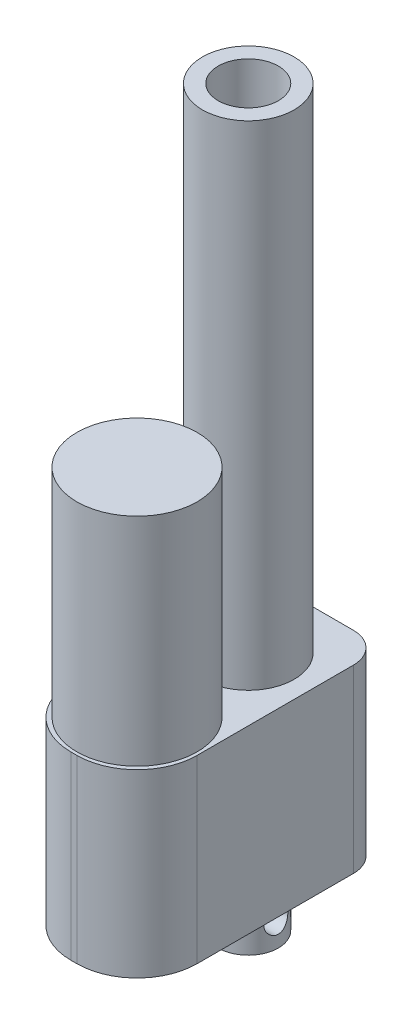
ISO-10303-21;
HEADER;
FILE_DESCRIPTION(('STEP AP214'),'2;1');
FILE_NAME('part.step','',(''),(''),'','','');
FILE_SCHEMA(('AUTOMOTIVE_DESIGN { 1 0 10303 214 1 1 1 1 }'));
ENDSEC;
DATA;
#1=APPLICATION_CONTEXT('core data for automotive mechanical design processes');
#2=APPLICATION_PROTOCOL_DEFINITION('international standard','automotive_design',2000,#1);
#3=PRODUCT_CONTEXT('',#1,'mechanical');
#4=PRODUCT('Part','Part','',(#3));
#5=PRODUCT_RELATED_PRODUCT_CATEGORY('part','',(#4));
#6=PRODUCT_DEFINITION_FORMATION('','',#4);
#7=PRODUCT_DEFINITION_CONTEXT('part definition',#1,'design');
#8=PRODUCT_DEFINITION('design','',#6,#7);
#9=PRODUCT_DEFINITION_SHAPE('','',#8);
#10=(LENGTH_UNIT() NAMED_UNIT(*) SI_UNIT(.MILLI.,.METRE.));
#11=(NAMED_UNIT(*) PLANE_ANGLE_UNIT() SI_UNIT($,.RADIAN.));
#12=(NAMED_UNIT(*) SI_UNIT($,.STERADIAN.) SOLID_ANGLE_UNIT());
#13=UNCERTAINTY_MEASURE_WITH_UNIT(LENGTH_MEASURE(1.E-05),#10,'distance_accuracy_value','');
#14=(GEOMETRIC_REPRESENTATION_CONTEXT(3) GLOBAL_UNCERTAINTY_ASSIGNED_CONTEXT((#13)) GLOBAL_UNIT_ASSIGNED_CONTEXT((#10,
#11,#12)) REPRESENTATION_CONTEXT('',''));
#15=CARTESIAN_POINT('',(0.,0.,0.));
#16=DIRECTION('',(0.,0.,1.));
#17=DIRECTION('',(1.,0.,0.));
#18=AXIS2_PLACEMENT_3D('',#15,#16,#17);
#19=CARTESIAN_POINT('',(-1.,-60.,38.));
#20=DIRECTION('',(0.,-1.,0.));
#21=DIRECTION('',(0.,0.,-1.));
#22=AXIS2_PLACEMENT_3D('',#19,#20,#21);
#23=PLANE('',#22);
#24=DIRECTION('',(1.,0.,0.));
#25=VECTOR('',#24,1.);
#26=CARTESIAN_POINT('',(-21.,-60.,-24.));
#27=LINE('',#26,#25);
#28=CARTESIAN_POINT('',(-11.,-60.,-24.));
#29=VERTEX_POINT('',#28);
#30=CARTESIAN_POINT('',(11.,-60.,-24.));
#31=VERTEX_POINT('',#30);
#32=EDGE_CURVE('E242',#29,#31,#27,.T.);
#33=ORIENTED_EDGE('',*,*,#32,.T.);
#34=CARTESIAN_POINT('',(11.,-60.,-14.));
#35=DIRECTION('',(0.,-1.,0.));
#36=DIRECTION('',(0.,0.,-1.));
#37=AXIS2_PLACEMENT_3D('',#34,#35,#36);
#38=CIRCLE('',#37,10.);
#39=CARTESIAN_POINT('',(21.,-60.,-14.));
#40=VERTEX_POINT('',#39);
#41=EDGE_CURVE('E42',#31,#40,#38,.T.);
#42=ORIENTED_EDGE('',*,*,#41,.T.);
#43=DIRECTION('',(0.,0.,1.));
#44=VECTOR('',#43,1.);
#45=CARTESIAN_POINT('',(21.,-60.,37.9999999999999));
#46=LINE('',#45,#44);
#47=CARTESIAN_POINT('',(21.,-60.,37.9999999999999));
#48=VERTEX_POINT('',#47);
#49=EDGE_CURVE('E100',#40,#48,#46,.T.);
#50=ORIENTED_EDGE('',*,*,#49,.T.);
#51=CARTESIAN_POINT('',(0.999999999999997,-60.,38.));
#52=DIRECTION('',(0.,-1.,0.));
#53=DIRECTION('',(0.,0.,-1.));
#54=AXIS2_PLACEMENT_3D('',#51,#52,#53);
#55=CIRCLE('',#54,20.);
#56=CARTESIAN_POINT('',(0.999999999999852,-60.,58.));
#57=VERTEX_POINT('',#56);
#58=EDGE_CURVE('E103',#48,#57,#55,.T.);
#59=ORIENTED_EDGE('',*,*,#58,.T.);
#60=DIRECTION('',(-1.,0.,0.));
#61=VECTOR('',#60,1.);
#62=CARTESIAN_POINT('',(-0.999999999999862,-60.,58.));
#63=LINE('',#62,#61);
#64=CARTESIAN_POINT('',(-0.99999999999986,-60.,58.));
#65=VERTEX_POINT('',#64);
#66=EDGE_CURVE('E119',#57,#65,#63,.T.);
#67=ORIENTED_EDGE('',*,*,#66,.T.);
#68=CARTESIAN_POINT('',(-1.,-60.,38.));
#69=DIRECTION('',(0.,-1.,0.));
#70=DIRECTION('',(0.,0.,-1.));
#71=AXIS2_PLACEMENT_3D('',#68,#69,#70);
#72=CIRCLE('',#71,20.);
#73=CARTESIAN_POINT('',(-21.,-60.,37.9999999999999));
#74=VERTEX_POINT('',#73);
#75=EDGE_CURVE('E258',#65,#74,#72,.T.);
#76=ORIENTED_EDGE('',*,*,#75,.T.);
#77=DIRECTION('',(0.,0.,-1.));
#78=VECTOR('',#77,1.);
#79=CARTESIAN_POINT('',(-21.,-60.,37.9999999999999));
#80=LINE('',#79,#78);
#81=CARTESIAN_POINT('',(-21.,-60.,-14.));
#82=VERTEX_POINT('',#81);
#83=EDGE_CURVE('E262',#74,#82,#80,.T.);
#84=ORIENTED_EDGE('',*,*,#83,.T.);
#85=CARTESIAN_POINT('',(-11.,-60.,-14.));
#86=DIRECTION('',(0.,-1.,0.));
#87=DIRECTION('',(0.,0.,-1.));
#88=AXIS2_PLACEMENT_3D('',#85,#86,#87);
#89=CIRCLE('',#88,10.);
#90=EDGE_CURVE('E219',#82,#29,#89,.T.);
#91=ORIENTED_EDGE('',*,*,#90,.T.);
#92=EDGE_LOOP('',(#33,#42,#50,#59,#67,#76,#84,#91));
#93=FACE_BOUND('',#92,.T.);
#94=CARTESIAN_POINT('',(0.,-60.,0.));
#95=DIRECTION('',(0.,-1.,0.));
#96=DIRECTION('',(0.,0.,-1.));
#97=AXIS2_PLACEMENT_3D('',#94,#95,#96);
#98=CIRCLE('',#97,10.);
#99=CARTESIAN_POINT('',(0.,-60.,-10.));
#100=VERTEX_POINT('',#99);
#101=EDGE_CURVE('E266',#100,#100,#98,.T.);
#102=ORIENTED_EDGE('',*,*,#101,.F.);
#103=EDGE_LOOP('',(#102));
#104=FACE_BOUND('',#103,.T.);
#105=ADVANCED_FACE('F34',(#93,#104),#23,.T.);
#106=CARTESIAN_POINT('',(-1.,0.,38.));
#107=DIRECTION('',(0.,-1.,0.));
#108=DIRECTION('',(0.,0.,-1.));
#109=AXIS2_PLACEMENT_3D('',#106,#107,#108);
#110=PLANE('',#109);
#111=CARTESIAN_POINT('',(0.,0.,0.));
#112=DIRECTION('',(0.,-1.,0.));
#113=DIRECTION('',(0.,0.,-1.));
#114=AXIS2_PLACEMENT_3D('',#111,#112,#113);
#115=CIRCLE('',#114,15.25);
#116=CARTESIAN_POINT('',(0.,0.,-15.25));
#117=VERTEX_POINT('',#116);
#118=EDGE_CURVE('E125',#117,#117,#115,.T.);
#119=ORIENTED_EDGE('',*,*,#118,.T.);
#120=EDGE_LOOP('',(#119));
#121=FACE_BOUND('',#120,.T.);
#122=DIRECTION('',(0.,0.,1.));
#123=VECTOR('',#122,1.);
#124=CARTESIAN_POINT('',(21.,0.,37.9999999999999));
#125=LINE('',#124,#123);
#126=CARTESIAN_POINT('',(21.,0.,-14.));
#127=VERTEX_POINT('',#126);
#128=CARTESIAN_POINT('',(21.,0.,37.9999999999999));
#129=VERTEX_POINT('',#128);
#130=EDGE_CURVE('E123',#127,#129,#125,.T.);
#131=ORIENTED_EDGE('',*,*,#130,.F.);
#132=CARTESIAN_POINT('',(11.,0.,-14.));
#133=DIRECTION('',(0.,-1.,0.));
#134=DIRECTION('',(0.,0.,-1.));
#135=AXIS2_PLACEMENT_3D('',#132,#133,#134);
#136=CIRCLE('',#135,10.);
#137=CARTESIAN_POINT('',(11.,0.,-24.));
#138=VERTEX_POINT('',#137);
#139=EDGE_CURVE('E226',#127,#138,#136,.F.);
#140=ORIENTED_EDGE('',*,*,#139,.T.);
#141=DIRECTION('',(1.,0.,0.));
#142=VECTOR('',#141,1.);
#143=CARTESIAN_POINT('',(-21.,0.,-24.));
#144=LINE('',#143,#142);
#145=CARTESIAN_POINT('',(-11.,0.,-24.));
#146=VERTEX_POINT('',#145);
#147=EDGE_CURVE('E110',#146,#138,#144,.T.);
#148=ORIENTED_EDGE('',*,*,#147,.F.);
#149=CARTESIAN_POINT('',(-11.,0.,-14.));
#150=DIRECTION('',(0.,-1.,0.));
#151=DIRECTION('',(0.,0.,-1.));
#152=AXIS2_PLACEMENT_3D('',#149,#150,#151);
#153=CIRCLE('',#152,10.);
#154=CARTESIAN_POINT('',(-21.,0.,-14.));
#155=VERTEX_POINT('',#154);
#156=EDGE_CURVE('E228',#146,#155,#153,.F.);
#157=ORIENTED_EDGE('',*,*,#156,.T.);
#158=DIRECTION('',(0.,0.,-1.));
#159=VECTOR('',#158,1.);
#160=CARTESIAN_POINT('',(-21.,0.,37.9999999999999));
#161=LINE('',#160,#159);
#162=CARTESIAN_POINT('',(-21.,0.,37.9999999999999));
#163=VERTEX_POINT('',#162);
#164=EDGE_CURVE('E248',#163,#155,#161,.T.);
#165=ORIENTED_EDGE('',*,*,#164,.F.);
#166=CARTESIAN_POINT('',(-1.,0.,38.));
#167=DIRECTION('',(0.,-1.,0.));
#168=DIRECTION('',(0.,0.,-1.));
#169=AXIS2_PLACEMENT_3D('',#166,#167,#168);
#170=CIRCLE('',#169,20.);
#171=CARTESIAN_POINT('',(-0.99999999999986,0.,58.));
#172=VERTEX_POINT('',#171);
#173=EDGE_CURVE('E246',#172,#163,#170,.T.);
#174=ORIENTED_EDGE('',*,*,#173,.F.);
#175=DIRECTION('',(-1.,0.,0.));
#176=VECTOR('',#175,1.);
#177=CARTESIAN_POINT('',(-0.999999999999862,0.,58.));
#178=LINE('',#177,#176);
#179=CARTESIAN_POINT('',(0.999999999999852,0.,58.));
#180=VERTEX_POINT('',#179);
#181=EDGE_CURVE('E236',#180,#172,#178,.T.);
#182=ORIENTED_EDGE('',*,*,#181,.F.);
#183=CARTESIAN_POINT('',(0.999999999999997,0.,38.));
#184=DIRECTION('',(0.,-1.,0.));
#185=DIRECTION('',(0.,0.,-1.));
#186=AXIS2_PLACEMENT_3D('',#183,#184,#185);
#187=CIRCLE('',#186,20.);
#188=EDGE_CURVE('E233',#129,#180,#187,.T.);
#189=ORIENTED_EDGE('',*,*,#188,.F.);
#190=EDGE_LOOP('',(#131,#140,#148,#157,#165,#174,#182,#189));
#191=FACE_BOUND('',#190,.T.);
#192=CARTESIAN_POINT('',(0.,0.,37.));
#193=DIRECTION('',(0.,-1.,0.));
#194=DIRECTION('',(0.,0.,-1.));
#195=AXIS2_PLACEMENT_3D('',#192,#193,#194);
#196=CIRCLE('',#195,20.);
#197=CARTESIAN_POINT('',(0.,0.,17.));
#198=VERTEX_POINT('',#197);
#199=EDGE_CURVE('E136',#198,#198,#196,.F.);
#200=ORIENTED_EDGE('',*,*,#199,.F.);
#201=EDGE_LOOP('',(#200));
#202=FACE_BOUND('',#201,.T.);
#203=ADVANCED_FACE('F174',(#121,#191,#202),#110,.F.);
#204=CARTESIAN_POINT('',(0.,164.,0.));
#205=DIRECTION('',(0.,-1.,0.));
#206=DIRECTION('',(0.,0.,-1.));
#207=AXIS2_PLACEMENT_3D('',#204,#205,#206);
#208=CYLINDRICAL_SURFACE('',#207,15.25);
#209=CARTESIAN_POINT('',(0.,164.,0.));
#210=DIRECTION('',(0.,1.,0.));
#211=DIRECTION('',(0.,0.,1.));
#212=AXIS2_PLACEMENT_3D('',#209,#210,#211);
#213=CIRCLE('',#212,15.25);
#214=CARTESIAN_POINT('',(0.,164.,15.25));
#215=VERTEX_POINT('',#214);
#216=EDGE_CURVE('E128',#215,#215,#213,.T.);
#217=ORIENTED_EDGE('',*,*,#216,.F.);
#218=EDGE_LOOP('',(#217));
#219=FACE_BOUND('',#218,.T.);
#220=ORIENTED_EDGE('',*,*,#118,.F.);
#221=EDGE_LOOP('',(#220));
#222=FACE_BOUND('',#221,.T.);
#223=ADVANCED_FACE('F179',(#219,#222),#208,.T.);
#224=CARTESIAN_POINT('',(0.,164.,0.));
#225=DIRECTION('',(0.,1.,0.));
#226=DIRECTION('',(0.,0.,1.));
#227=AXIS2_PLACEMENT_3D('',#224,#225,#226);
#228=PLANE('',#227);
#229=CARTESIAN_POINT('',(0.,164.,0.));
#230=DIRECTION('',(0.,1.,0.));
#231=DIRECTION('',(0.,0.,1.));
#232=AXIS2_PLACEMENT_3D('',#229,#230,#231);
#233=CIRCLE('',#232,10.);
#234=CARTESIAN_POINT('',(0.,164.,10.));
#235=VERTEX_POINT('',#234);
#236=EDGE_CURVE('E270',#235,#235,#233,.T.);
#237=ORIENTED_EDGE('',*,*,#236,.F.);
#238=EDGE_LOOP('',(#237));
#239=FACE_BOUND('',#238,.T.);
#240=ORIENTED_EDGE('',*,*,#216,.T.);
#241=EDGE_LOOP('',(#240));
#242=FACE_BOUND('',#241,.T.);
#243=ADVANCED_FACE('F203',(#239,#242),#228,.T.);
#244=CARTESIAN_POINT('',(21.,-60.,37.9999999999999));
#245=DIRECTION('',(-1.,0.,0.));
#246=DIRECTION('',(0.,0.,1.));
#247=AXIS2_PLACEMENT_3D('',#244,#245,#246);
#248=PLANE('',#247);
#249=ORIENTED_EDGE('',*,*,#49,.F.);
#250=DIRECTION('',(0.,1.,0.));
#251=VECTOR('',#250,1.);
#252=CARTESIAN_POINT('',(21.,-60.,-14.));
#253=LINE('',#252,#251);
#254=EDGE_CURVE('E139',#40,#127,#253,.T.);
#255=ORIENTED_EDGE('',*,*,#254,.T.);
#256=ORIENTED_EDGE('',*,*,#130,.T.);
#257=DIRECTION('',(0.,1.,0.));
#258=VECTOR('',#257,1.);
#259=CARTESIAN_POINT('',(21.,-60.,37.9999999999999));
#260=LINE('',#259,#258);
#261=EDGE_CURVE('E115',#48,#129,#260,.T.);
#262=ORIENTED_EDGE('',*,*,#261,.F.);
#263=EDGE_LOOP('',(#249,#255,#256,#262));
#264=FACE_BOUND('',#263,.T.);
#265=ADVANCED_FACE('F121',(#264),#248,.F.);
#266=CARTESIAN_POINT('',(0.999999999999997,-60.,38.));
#267=DIRECTION('',(0.,1.,0.));
#268=DIRECTION('',(0.,0.,1.));
#269=AXIS2_PLACEMENT_3D('',#266,#267,#268);
#270=CYLINDRICAL_SURFACE('',#269,20.);
#271=ORIENTED_EDGE('',*,*,#188,.T.);
#272=DIRECTION('',(0.,1.,0.));
#273=VECTOR('',#272,1.);
#274=CARTESIAN_POINT('',(0.999999999999852,-60.,58.));
#275=LINE('',#274,#273);
#276=EDGE_CURVE('E117',#57,#180,#275,.T.);
#277=ORIENTED_EDGE('',*,*,#276,.F.);
#278=ORIENTED_EDGE('',*,*,#58,.F.);
#279=ORIENTED_EDGE('',*,*,#261,.T.);
#280=EDGE_LOOP('',(#271,#277,#278,#279));
#281=FACE_BOUND('',#280,.T.);
#282=ADVANCED_FACE('F114',(#281),#270,.T.);
#283=CARTESIAN_POINT('',(-0.999999999999862,-60.,58.));
#284=DIRECTION('',(0.,0.,-1.));
#285=DIRECTION('',(-1.,0.,0.));
#286=AXIS2_PLACEMENT_3D('',#283,#284,#285);
#287=PLANE('',#286);
#288=ORIENTED_EDGE('',*,*,#181,.T.);
#289=DIRECTION('',(0.,1.,0.));
#290=VECTOR('',#289,1.);
#291=CARTESIAN_POINT('',(-0.99999999999986,-60.,58.));
#292=LINE('',#291,#290);
#293=EDGE_CURVE('E130',#65,#172,#292,.T.);
#294=ORIENTED_EDGE('',*,*,#293,.F.);
#295=ORIENTED_EDGE('',*,*,#66,.F.);
#296=ORIENTED_EDGE('',*,*,#276,.T.);
#297=EDGE_LOOP('',(#288,#294,#295,#296));
#298=FACE_BOUND('',#297,.T.);
#299=ADVANCED_FACE('F194',(#298),#287,.F.);
#300=CARTESIAN_POINT('',(-1.,-60.,38.));
#301=DIRECTION('',(0.,1.,0.));
#302=DIRECTION('',(0.,0.,1.));
#303=AXIS2_PLACEMENT_3D('',#300,#301,#302);
#304=CYLINDRICAL_SURFACE('',#303,20.);
#305=ORIENTED_EDGE('',*,*,#173,.T.);
#306=DIRECTION('',(0.,1.,0.));
#307=VECTOR('',#306,1.);
#308=CARTESIAN_POINT('',(-21.,-60.,37.9999999999999));
#309=LINE('',#308,#307);
#310=EDGE_CURVE('E251',#74,#163,#309,.T.);
#311=ORIENTED_EDGE('',*,*,#310,.F.);
#312=ORIENTED_EDGE('',*,*,#75,.F.);
#313=ORIENTED_EDGE('',*,*,#293,.T.);
#314=EDGE_LOOP('',(#305,#311,#312,#313));
#315=FACE_BOUND('',#314,.T.);
#316=ADVANCED_FACE('F191',(#315),#304,.T.);
#317=CARTESIAN_POINT('',(-21.,-60.,37.9999999999999));
#318=DIRECTION('',(1.,0.,0.));
#319=DIRECTION('',(0.,0.,-1.));
#320=AXIS2_PLACEMENT_3D('',#317,#318,#319);
#321=PLANE('',#320);
#322=ORIENTED_EDGE('',*,*,#164,.T.);
#323=DIRECTION('',(0.,1.,0.));
#324=VECTOR('',#323,1.);
#325=CARTESIAN_POINT('',(-21.,-60.,-14.));
#326=LINE('',#325,#324);
#327=EDGE_CURVE('E11',#155,#82,#326,.F.);
#328=ORIENTED_EDGE('',*,*,#327,.T.);
#329=ORIENTED_EDGE('',*,*,#83,.F.);
#330=ORIENTED_EDGE('',*,*,#310,.T.);
#331=EDGE_LOOP('',(#322,#328,#329,#330));
#332=FACE_BOUND('',#331,.T.);
#333=ADVANCED_FACE('F188',(#332),#321,.F.);
#334=CARTESIAN_POINT('',(-21.,-60.,-24.));
#335=DIRECTION('',(0.,0.,1.));
#336=DIRECTION('',(1.,0.,0.));
#337=AXIS2_PLACEMENT_3D('',#334,#335,#336);
#338=PLANE('',#337);
#339=ORIENTED_EDGE('',*,*,#147,.T.);
#340=DIRECTION('',(0.,1.,0.));
#341=VECTOR('',#340,1.);
#342=CARTESIAN_POINT('',(11.,-60.,-24.));
#343=LINE('',#342,#341);
#344=EDGE_CURVE('E55',#138,#31,#343,.F.);
#345=ORIENTED_EDGE('',*,*,#344,.T.);
#346=ORIENTED_EDGE('',*,*,#32,.F.);
#347=DIRECTION('',(0.,1.,0.));
#348=VECTOR('',#347,1.);
#349=CARTESIAN_POINT('',(-11.,-60.,-24.));
#350=LINE('',#349,#348);
#351=EDGE_CURVE('E223',#29,#146,#350,.T.);
#352=ORIENTED_EDGE('',*,*,#351,.T.);
#353=EDGE_LOOP('',(#339,#345,#346,#352));
#354=FACE_BOUND('',#353,.T.);
#355=ADVANCED_FACE('F185',(#354),#338,.F.);
#356=CARTESIAN_POINT('',(0.,72.,37.));
#357=DIRECTION('',(0.,-1.,0.));
#358=DIRECTION('',(0.,0.,-1.));
#359=AXIS2_PLACEMENT_3D('',#356,#357,#358);
#360=CYLINDRICAL_SURFACE('',#359,20.);
#361=CARTESIAN_POINT('',(0.,72.,37.));
#362=DIRECTION('',(0.,1.,0.));
#363=DIRECTION('',(0.,0.,1.));
#364=AXIS2_PLACEMENT_3D('',#361,#362,#363);
#365=CIRCLE('',#364,20.);
#366=CARTESIAN_POINT('',(0.,72.,57.));
#367=VERTEX_POINT('',#366);
#368=EDGE_CURVE('E234',#367,#367,#365,.T.);
#369=ORIENTED_EDGE('',*,*,#368,.F.);
#370=EDGE_LOOP('',(#369));
#371=FACE_BOUND('',#370,.T.);
#372=ORIENTED_EDGE('',*,*,#199,.T.);
#373=EDGE_LOOP('',(#372));
#374=FACE_BOUND('',#373,.T.);
#375=ADVANCED_FACE('F183',(#371,#374),#360,.T.);
#376=CARTESIAN_POINT('',(0.,72.,37.));
#377=DIRECTION('',(0.,1.,0.));
#378=DIRECTION('',(0.,0.,1.));
#379=AXIS2_PLACEMENT_3D('',#376,#377,#378);
#380=PLANE('',#379);
#381=ORIENTED_EDGE('',*,*,#368,.T.);
#382=EDGE_LOOP('',(#381));
#383=FACE_BOUND('',#382,.T.);
#384=ADVANCED_FACE('F170',(#383),#380,.T.);
#385=CARTESIAN_POINT('',(0.,-80.,0.));
#386=DIRECTION('',(0.,1.,0.));
#387=DIRECTION('',(0.,0.,1.));
#388=AXIS2_PLACEMENT_3D('',#385,#386,#387);
#389=CYLINDRICAL_SURFACE('',#388,10.);
#390=CARTESIAN_POINT('',(-9.16515138991168,-72.,-4.));
#391=CARTESIAN_POINT('',(-9.16515220722506,-71.8928225032156,-3.99999917996685));
#392=CARTESIAN_POINT('',(-9.16703782704588,-71.7856121402052,-3.99568627578832));
#393=CARTESIAN_POINT('',(-9.17451890581268,-71.5719679058293,-3.97847804504315));
#394=CARTESIAN_POINT('',(-9.18011663538446,-71.4655345500547,-3.965577465543));
#395=CARTESIAN_POINT('',(-9.19485078616074,-71.2540640466445,-3.9312935770878));
#396=CARTESIAN_POINT('',(-9.20399425848326,-71.1490301151513,-3.90989336356572));
#397=CARTESIAN_POINT('',(-9.2255144619826,-70.9413124028102,-3.85883937208579));
#398=CARTESIAN_POINT('',(-9.23789253541712,-70.8386296168982,-3.82918216740128));
#399=CARTESIAN_POINT('',(-9.27920231487636,-70.5360102733714,-3.72849978450445));
#400=CARTESIAN_POINT('',(-9.31238810193525,-70.3404620790357,-3.64559228099563));
#401=CARTESIAN_POINT('',(-9.38629512671437,-69.9661987313271,-3.45083256453889));
#402=CARTESIAN_POINT('',(-9.42701471853534,-69.7874799141088,-3.33898667159604));
#403=CARTESIAN_POINT('',(-9.51401677460926,-69.4414881863986,-3.08264624953204));
#404=CARTESIAN_POINT('',(-9.56047821792022,-69.275289566711,-2.93675933272146));
#405=CARTESIAN_POINT('',(-9.65224928088017,-68.9689395919581,-2.61941759406606));
#406=CARTESIAN_POINT('',(-9.69755849326326,-68.828797339245,-2.44795387495429));
#407=CARTESIAN_POINT('',(-9.78406811808174,-68.5731878901629,-2.07601279575004));
#408=CARTESIAN_POINT('',(-9.82503606295845,-68.4589115800306,-1.87465797803874));
#409=CARTESIAN_POINT('',(-9.89607856333948,-68.266312680323,-1.45365059895514));
#410=CARTESIAN_POINT('',(-9.92615755049622,-68.1879754605667,-1.23400552632833));
#411=CARTESIAN_POINT('',(-9.97076649749865,-68.073317072677,-0.79393286533242));
#412=CARTESIAN_POINT('',(-9.98597873479395,-68.0351453840019,-0.574057972725516));
#413=CARTESIAN_POINT('',(-10.001606214367,-67.9959430164992,-0.130532654160151));
#414=CARTESIAN_POINT('',(-10.0020269755724,-67.9948984849555,0.0931163324631272));
#415=CARTESIAN_POINT('',(-9.98843925626005,-68.0289655425464,0.52446498866394));
#416=CARTESIAN_POINT('',(-9.97523993538891,-68.0620495462971,0.732354905542466));
#417=CARTESIAN_POINT('',(-9.93698582942363,-68.1599857518182,1.13934621864231));
#418=CARTESIAN_POINT('',(-9.91193017443785,-68.2248402845843,1.33844696883604));
#419=CARTESIAN_POINT('',(-9.85193648913816,-68.3852729659723,1.72579587696676));
#420=CARTESIAN_POINT('',(-9.81685520932147,-68.4812994296887,1.91383524674319));
#421=CARTESIAN_POINT('',(-9.7402917036085,-68.7009300137803,2.27161630149723));
#422=CARTESIAN_POINT('',(-9.69880728534381,-68.8245435861843,2.44135168543996));
#423=CARTESIAN_POINT('',(-9.61043274352156,-69.1052982719048,2.76953765597606));
#424=CARTESIAN_POINT('',(-9.56336653023493,-69.2641077851502,2.92651569053149));
#425=CARTESIAN_POINT('',(-9.47123321946549,-69.6059811436594,3.21221483078646));
#426=CARTESIAN_POINT('',(-9.42616678016159,-69.78905289639,3.34092668757429));
#427=CARTESIAN_POINT('',(-9.34193794818039,-70.1808380447491,3.56980837743823));
#428=CARTESIAN_POINT('',(-9.30297828115414,-70.3901296606776,3.66906930327244));
#429=CARTESIAN_POINT('',(-9.23775180688171,-70.8244309806241,3.83035251973301));
#430=CARTESIAN_POINT('',(-9.21147675782622,-71.0494303694531,3.89239899675599));
#431=CARTESIAN_POINT('',(-9.17659519405432,-71.4940715549349,3.97390989770977));
#432=CARTESIAN_POINT('',(-9.16700732912275,-71.7132008942571,3.99574419362908));
#433=CARTESIAN_POINT('',(-9.16378995738077,-72.1521544155191,4.00312265288578));
#434=CARTESIAN_POINT('',(-9.17015561120724,-72.3719783665513,3.98867782118257));
#435=CARTESIAN_POINT('',(-9.19712088718227,-72.7929178699139,3.92606578958006));
#436=CARTESIAN_POINT('',(-9.21688915596603,-72.9943858748,3.87986612404771));
#437=CARTESIAN_POINT('',(-9.26740102054679,-73.386576809571,3.75760837382175));
#438=CARTESIAN_POINT('',(-9.29814704977195,-73.5772973462148,3.68154366860459));
#439=CARTESIAN_POINT('',(-9.36867563720203,-73.9512047155908,3.49827127896311));
#440=CARTESIAN_POINT('',(-9.40877409278357,-74.1337723773872,3.38992573652914));
#441=CARTESIAN_POINT('',(-9.49300770315587,-74.478965974885,3.14633044888379));
#442=CARTESIAN_POINT('',(-9.5371444979208,-74.6415837455978,3.01106974696435));
#443=CARTESIAN_POINT('',(-9.62841831942843,-74.9547468171913,2.70568842336056));
#444=CARTESIAN_POINT('',(-9.67553614570507,-75.1035131305545,2.53373085888854));
#445=CARTESIAN_POINT('',(-9.76439589135024,-75.3703541532482,2.16616726673934));
#446=CARTESIAN_POINT('',(-9.80613759186121,-75.4884276132975,1.97056027694192));
#447=CARTESIAN_POINT('',(-9.87967431800929,-75.6900952528195,1.56055986799732));
#448=CARTESIAN_POINT('',(-9.9114717248188,-75.7736976879472,1.34617096196499));
#449=CARTESIAN_POINT('',(-9.96145426937249,-75.9030977051994,0.904787181861565));
#450=CARTESIAN_POINT('',(-9.97964679410119,-75.9489158043134,0.677799220674798));
#451=CARTESIAN_POINT('',(-9.99958016425668,-75.999009401911,0.233633020611975));
#452=CARTESIAN_POINT('',(-10.0023169350655,-76.0058002520768,0.0167809848943046));
#453=CARTESIAN_POINT('',(-9.99372084740381,-75.9842890462796,-0.414867671174725));
#454=CARTESIAN_POINT('',(-9.98239011871255,-75.9559923024791,-0.629664597702892));
#455=CARTESIAN_POINT('',(-9.94743026789157,-75.8669064057872,-1.04434180494581));
#456=CARTESIAN_POINT('',(-9.92418961491739,-75.8071420434949,-1.2444776131699));
#457=CARTESIAN_POINT('',(-9.86789895440956,-75.6578944552422,-1.63184470564404));
#458=CARTESIAN_POINT('',(-9.83484713776136,-75.568405747944,-1.81907360209112));
#459=CARTESIAN_POINT('',(-9.76036189588764,-75.3577933524316,-2.18440609879394));
#460=CARTESIAN_POINT('',(-9.71862262764551,-75.2354464559039,-2.3617408310488));
#461=CARTESIAN_POINT('',(-9.63178803063432,-74.9644239163638,-2.69410799958838));
#462=CARTESIAN_POINT('',(-9.58669131729773,-74.8157373759609,-2.849131156699));
#463=CARTESIAN_POINT('',(-9.49475540255923,-74.4853657611342,-3.14240275826141));
#464=CARTESIAN_POINT('',(-9.4479811565371,-74.3022077012979,-3.27901865020172));
#465=CARTESIAN_POINT('',(-9.36099292501489,-73.9141302787523,-3.51969402497222));
#466=CARTESIAN_POINT('',(-9.32077971107738,-73.7092083613338,-3.62374968011083));
#467=CARTESIAN_POINT('',(-9.25517900642369,-73.3018760562204,-3.78798515690828));
#468=CARTESIAN_POINT('',(-9.22878451494603,-73.1008923240541,-3.85126569346866));
#469=CARTESIAN_POINT('',(-9.1988556584339,-72.7933610402093,-3.92194632104984));
#470=CARTESIAN_POINT('',(-9.19049270633767,-72.6899269641056,-3.94146052144918));
#471=CARTESIAN_POINT('',(-9.17721200341611,-72.4816430703891,-3.97228850679684));
#472=CARTESIAN_POINT('',(-9.17229225293171,-72.3767941106041,-3.98360705155155));
#473=CARTESIAN_POINT('',(-9.16783675423417,-72.2264494086476,-3.99384232103284));
#474=CARTESIAN_POINT('',(-9.16683059815414,-72.1812001696778,-3.99615058414994));
#475=CARTESIAN_POINT('',(-9.16548771864777,-72.0906359157854,-3.99922965337524));
#476=CARTESIAN_POINT('',(-9.16515104430392,-72.0453208962838,-4.00000034675784));
#477=CARTESIAN_POINT('',(-9.16515138991168,-72.,-4.));
#478=B_SPLINE_CURVE_WITH_KNOTS('',3,(#390,#391,#392,#393,#394,#395,#396,#397,#398,#399,#400,
#401,#402,#403,#404,#405,#406,#407,#408,#409,#410,#411,#412,#413,#414,#415,#416,#417,#418,#419,
#420,#421,#422,#423,#424,#425,#426,#427,#428,#429,#430,#431,#432,#433,#434,#435,#436,#437,#438,
#439,#440,#441,#442,#443,#444,#445,#446,#447,#448,#449,#450,#451,#452,#453,#454,#455,#456,#457,
#458,#459,#460,#461,#462,#463,#464,#465,#466,#467,#468,#469,#470,#471,#472,#473,#474,#475,#476,
#477),.UNSPECIFIED.,.T.,.F.,(4,2,2,2,2,2,2,2,2,2,2,2,2,2,2,2,2,2,2,2,2,2,2,2,2,2,2,2,2,2,2,2,2,
2,2,2,2,2,2,2,2,2,2,4),(0.,0.321486083338399,0.643168995111192,0.965494918272702,
1.28795480954364,1.92974178448592,2.57138871437637,3.24631250358763,3.92147162486599,
4.62325351972771,5.32474947728876,5.99228379564282,6.65956904401259,7.2893730345052,
7.91922324048034,8.55856614259711,9.19812843669978,9.87968101952628,10.5614562804417,
11.2624893122443,11.9630662339012,12.6208430883876,13.2784204360579,13.8985450996021,
14.5188073109319,15.1642232309532,15.8099024284161,16.5032748228388,17.1966754349541,
17.8899098841554,18.5827676569819,19.2304209330182,19.8779761681512,20.5056400267662,
21.1334196944709,21.7889411606977,22.4447344691833,23.1411252036114,23.8375977730829,
24.4715333542807,24.7879924179097,25.1042675432749,25.240200643082,25.3761437083411),.UNSPECIFIED.);
#479=CARTESIAN_POINT('',(-9.16515138991168,-72.,-4.));
#480=VERTEX_POINT('',#479);
#481=EDGE_CURVE('E147',#480,#480,#478,.T.);
#482=ORIENTED_EDGE('',*,*,#481,.T.);
#483=EDGE_LOOP('',(#482));
#484=FACE_BOUND('',#483,.T.);
#485=CARTESIAN_POINT('',(9.16515138991168,-72.,-4.));
#486=CARTESIAN_POINT('',(9.16515220722506,-72.1071774967844,-3.99999917996685));
#487=CARTESIAN_POINT('',(9.16703782704588,-72.2143878597948,-3.99568627578832));
#488=CARTESIAN_POINT('',(9.17451890581268,-72.4280320941707,-3.97847804504315));
#489=CARTESIAN_POINT('',(9.18011663538446,-72.5344654499453,-3.965577465543));
#490=CARTESIAN_POINT('',(9.19485078616074,-72.7459359533555,-3.9312935770878));
#491=CARTESIAN_POINT('',(9.20399425848326,-72.8509698848487,-3.90989336356572));
#492=CARTESIAN_POINT('',(9.2255144619826,-73.0586875971898,-3.85883937208579));
#493=CARTESIAN_POINT('',(9.23789253541712,-73.1613703831018,-3.82918216740128));
#494=CARTESIAN_POINT('',(9.27920231487636,-73.4639897266286,-3.72849978450445));
#495=CARTESIAN_POINT('',(9.31238810193525,-73.6595379209643,-3.64559228099563));
#496=CARTESIAN_POINT('',(9.38629512671437,-74.0338012686729,-3.45083256453889));
#497=CARTESIAN_POINT('',(9.42701471853534,-74.2125200858912,-3.33898667159604));
#498=CARTESIAN_POINT('',(9.51401677460926,-74.5585118136014,-3.08264624953204));
#499=CARTESIAN_POINT('',(9.56047821792022,-74.724710433289,-2.93675933272146));
#500=CARTESIAN_POINT('',(9.65224928088017,-75.0310604080419,-2.61941759406606));
#501=CARTESIAN_POINT('',(9.69755849326326,-75.1712026607549,-2.44795387495429));
#502=CARTESIAN_POINT('',(9.78406811808174,-75.4268121098371,-2.07601279575004));
#503=CARTESIAN_POINT('',(9.82503606295845,-75.5410884199694,-1.87465797803874));
#504=CARTESIAN_POINT('',(9.89607856333948,-75.7336873196769,-1.45365059895514));
#505=CARTESIAN_POINT('',(9.92615755049622,-75.8120245394332,-1.23400552632833));
#506=CARTESIAN_POINT('',(9.97076649749865,-75.926682927323,-0.79393286533242));
#507=CARTESIAN_POINT('',(9.98597873479395,-75.964854615998,-0.574057972725516));
#508=CARTESIAN_POINT('',(10.001606214367,-76.0040569835008,-0.130532654160151));
#509=CARTESIAN_POINT('',(10.0020269755724,-76.0051015150445,0.0931163324631272));
#510=CARTESIAN_POINT('',(9.98843925626005,-75.9710344574535,0.52446498866394));
#511=CARTESIAN_POINT('',(9.97523993538891,-75.9379504537029,0.732354905542466));
#512=CARTESIAN_POINT('',(9.93698582942363,-75.8400142481818,1.13934621864231));
#513=CARTESIAN_POINT('',(9.91193017443785,-75.7751597154156,1.33844696883604));
#514=CARTESIAN_POINT('',(9.85193648913816,-75.6147270340277,1.72579587696676));
#515=CARTESIAN_POINT('',(9.81685520932147,-75.5187005703113,1.91383524674319));
#516=CARTESIAN_POINT('',(9.7402917036085,-75.2990699862197,2.27161630149723));
#517=CARTESIAN_POINT('',(9.69880728534381,-75.1754564138157,2.44135168543996));
#518=CARTESIAN_POINT('',(9.61043274352156,-74.8947017280952,2.76953765597606));
#519=CARTESIAN_POINT('',(9.56336653023493,-74.7358922148498,2.92651569053149));
#520=CARTESIAN_POINT('',(9.47123321946549,-74.3940188563406,3.21221483078646));
#521=CARTESIAN_POINT('',(9.42616678016159,-74.21094710361,3.34092668757429));
#522=CARTESIAN_POINT('',(9.34193794818039,-73.8191619552508,3.56980837743823));
#523=CARTESIAN_POINT('',(9.30297828115414,-73.6098703393224,3.66906930327244));
#524=CARTESIAN_POINT('',(9.23775180688171,-73.1755690193759,3.83035251973301));
#525=CARTESIAN_POINT('',(9.21147675782622,-72.9505696305469,3.89239899675599));
#526=CARTESIAN_POINT('',(9.17659519405432,-72.505928445065,3.97390989770977));
#527=CARTESIAN_POINT('',(9.16700732912275,-72.2867991057429,3.99574419362908));
#528=CARTESIAN_POINT('',(9.16378995738077,-71.8478455844809,4.00312265288578));
#529=CARTESIAN_POINT('',(9.17015561120724,-71.6280216334487,3.98867782118257));
#530=CARTESIAN_POINT('',(9.19712088718227,-71.2070821300861,3.92606578958006));
#531=CARTESIAN_POINT('',(9.21688915596603,-71.0056141252,3.87986612404771));
#532=CARTESIAN_POINT('',(9.26740102054679,-70.613423190429,3.75760837382175));
#533=CARTESIAN_POINT('',(9.29814704977195,-70.4227026537852,3.68154366860459));
#534=CARTESIAN_POINT('',(9.36867563720203,-70.0487952844092,3.49827127896311));
#535=CARTESIAN_POINT('',(9.40877409278357,-69.8662276226128,3.38992573652914));
#536=CARTESIAN_POINT('',(9.49300770315587,-69.521034025115,3.14633044888379));
#537=CARTESIAN_POINT('',(9.5371444979208,-69.3584162544022,3.01106974696435));
#538=CARTESIAN_POINT('',(9.62841831942843,-69.0452531828087,2.70568842336056));
#539=CARTESIAN_POINT('',(9.67553614570507,-68.8964868694455,2.53373085888854));
#540=CARTESIAN_POINT('',(9.76439589135024,-68.6296458467518,2.16616726673934));
#541=CARTESIAN_POINT('',(9.80613759186121,-68.5115723867025,1.97056027694192));
#542=CARTESIAN_POINT('',(9.87967431800929,-68.3099047471805,1.56055986799732));
#543=CARTESIAN_POINT('',(9.9114717248188,-68.2263023120528,1.346170961965));
#544=CARTESIAN_POINT('',(9.96145426937248,-68.0969022948006,0.904787181861567));
#545=CARTESIAN_POINT('',(9.97964679410119,-68.0510841956866,0.677799220674799));
#546=CARTESIAN_POINT('',(9.99958016425668,-68.000990598089,0.233633020611975));
#547=CARTESIAN_POINT('',(10.0023169350655,-67.9941997479232,0.0167809848943046));
#548=CARTESIAN_POINT('',(9.99372084740381,-68.0157109537204,-0.414867671174725));
#549=CARTESIAN_POINT('',(9.98239011871255,-68.0440076975209,-0.629664597702892));
#550=CARTESIAN_POINT('',(9.94743026789157,-68.1330935942128,-1.04434180494581));
#551=CARTESIAN_POINT('',(9.92418961491739,-68.1928579565051,-1.2444776131699));
#552=CARTESIAN_POINT('',(9.86789895440956,-68.3421055447578,-1.63184470564404));
#553=CARTESIAN_POINT('',(9.83484713776136,-68.431594252056,-1.81907360209112));
#554=CARTESIAN_POINT('',(9.76036189588764,-68.6422066475684,-2.18440609879394));
#555=CARTESIAN_POINT('',(9.71862262764551,-68.7645535440961,-2.3617408310488));
#556=CARTESIAN_POINT('',(9.63178803063432,-69.0355760836361,-2.69410799958838));
#557=CARTESIAN_POINT('',(9.58669131729773,-69.1842626240391,-2.849131156699));
#558=CARTESIAN_POINT('',(9.49475540255923,-69.5146342388658,-3.14240275826141));
#559=CARTESIAN_POINT('',(9.4479811565371,-69.697792298702,-3.27901865020172));
#560=CARTESIAN_POINT('',(9.36099292501489,-70.0858697212477,-3.51969402497222));
#561=CARTESIAN_POINT('',(9.32077971107738,-70.2907916386662,-3.62374968011083));
#562=CARTESIAN_POINT('',(9.25517900642369,-70.6981239437796,-3.78798515690828));
#563=CARTESIAN_POINT('',(9.22878451494603,-70.8991076759459,-3.85126569346866));
#564=CARTESIAN_POINT('',(9.1988556584339,-71.2066389597907,-3.92194632104984));
#565=CARTESIAN_POINT('',(9.19049270633767,-71.3100730358944,-3.94146052144918));
#566=CARTESIAN_POINT('',(9.17721200341611,-71.5183569296109,-3.97228850679684));
#567=CARTESIAN_POINT('',(9.17229225293171,-71.6232058893959,-3.98360705155155));
#568=CARTESIAN_POINT('',(9.16783675423417,-71.7735505913524,-3.99384232103284));
#569=CARTESIAN_POINT('',(9.16683059815414,-71.8187998303222,-3.99615058414994));
#570=CARTESIAN_POINT('',(9.16548771864777,-71.9093640842146,-3.99922965337524));
#571=CARTESIAN_POINT('',(9.16515104430392,-71.9546791037162,-4.00000034675784));
#572=CARTESIAN_POINT('',(9.16515138991168,-72.,-4.));
#573=B_SPLINE_CURVE_WITH_KNOTS('',3,(#485,#486,#487,#488,#489,#490,#491,#492,#493,#494,#495,
#496,#497,#498,#499,#500,#501,#502,#503,#504,#505,#506,#507,#508,#509,#510,#511,#512,#513,#514,
#515,#516,#517,#518,#519,#520,#521,#522,#523,#524,#525,#526,#527,#528,#529,#530,#531,#532,#533,
#534,#535,#536,#537,#538,#539,#540,#541,#542,#543,#544,#545,#546,#547,#548,#549,#550,#551,#552,
#553,#554,#555,#556,#557,#558,#559,#560,#561,#562,#563,#564,#565,#566,#567,#568,#569,#570,#571,
#572),.UNSPECIFIED.,.T.,.F.,(4,2,2,2,2,2,2,2,2,2,2,2,2,2,2,2,2,2,2,2,2,2,2,2,2,2,2,2,2,2,2,2,2,
2,2,2,2,2,2,2,2,2,2,4),(0.,0.321486083338399,0.643168995111192,0.965494918272702,
1.28795480954364,1.92974178448592,2.57138871437637,3.24631250358763,3.92147162486599,
4.62325351972771,5.32474947728876,5.99228379564282,6.65956904401259,7.2893730345052,
7.91922324048034,8.55856614259711,9.19812843669978,9.87968101952628,10.5614562804417,
11.2624893122443,11.9630662339012,12.6208430883876,13.2784204360579,13.8985450996021,
14.5188073109319,15.1642232309532,15.8099024284161,16.5032748228388,17.1966754349541,
17.8899098841554,18.5827676569819,19.2304209330182,19.8779761681512,20.5056400267662,
21.1334196944709,21.7889411606977,22.4447344691833,23.1411252036114,23.8375977730829,
24.4715333542807,24.7879924179097,25.1042675432749,25.240200643082,25.3761437083411),.UNSPECIFIED.);
#574=CARTESIAN_POINT('',(9.16515138991168,-72.,-4.));
#575=VERTEX_POINT('',#574);
#576=EDGE_CURVE('E140',#575,#575,#573,.T.);
#577=ORIENTED_EDGE('',*,*,#576,.T.);
#578=EDGE_LOOP('',(#577));
#579=FACE_BOUND('',#578,.T.);
#580=CARTESIAN_POINT('',(0.,-80.,0.));
#581=DIRECTION('',(0.,-1.,0.));
#582=DIRECTION('',(0.,0.,-1.));
#583=AXIS2_PLACEMENT_3D('',#580,#581,#582);
#584=CIRCLE('',#583,10.);
#585=CARTESIAN_POINT('',(0.,-80.,-10.));
#586=VERTEX_POINT('',#585);
#587=EDGE_CURVE('E239',#586,#586,#584,.T.);
#588=ORIENTED_EDGE('',*,*,#587,.F.);
#589=EDGE_LOOP('',(#588));
#590=FACE_BOUND('',#589,.T.);
#591=ORIENTED_EDGE('',*,*,#101,.T.);
#592=EDGE_LOOP('',(#591));
#593=FACE_BOUND('',#592,.T.);
#594=ADVANCED_FACE('F152',(#484,#579,#590,#593),#389,.T.);
#595=CARTESIAN_POINT('',(0.,-80.,0.));
#596=DIRECTION('',(0.,-1.,0.));
#597=DIRECTION('',(0.,0.,-1.));
#598=AXIS2_PLACEMENT_3D('',#595,#596,#597);
#599=PLANE('',#598);
#600=ORIENTED_EDGE('',*,*,#587,.T.);
#601=EDGE_LOOP('',(#600));
#602=FACE_BOUND('',#601,.T.);
#603=ADVANCED_FACE('F161',(#602),#599,.T.);
#604=CARTESIAN_POINT('',(-15.,-72.,0.));
#605=DIRECTION('',(1.,0.,0.));
#606=DIRECTION('',(0.,0.,-1.));
#607=AXIS2_PLACEMENT_3D('',#604,#605,#606);
#608=CYLINDRICAL_SURFACE('',#607,4.);
#609=ORIENTED_EDGE('',*,*,#576,.F.);
#610=EDGE_LOOP('',(#609));
#611=FACE_BOUND('',#610,.T.);
#612=ORIENTED_EDGE('',*,*,#481,.F.);
#613=EDGE_LOOP('',(#612));
#614=FACE_BOUND('',#613,.T.);
#615=ADVANCED_FACE('F156',(#611,#614),#608,.F.);
#616=CARTESIAN_POINT('',(0.,14.,0.));
#617=DIRECTION('',(0.,1.,0.));
#618=DIRECTION('',(0.,0.,1.));
#619=AXIS2_PLACEMENT_3D('',#616,#617,#618);
#620=CYLINDRICAL_SURFACE('',#619,10.);
#621=CARTESIAN_POINT('',(0.,14.,0.));
#622=DIRECTION('',(0.,1.,0.));
#623=DIRECTION('',(0.,0.,1.));
#624=AXIS2_PLACEMENT_3D('',#621,#622,#623);
#625=CIRCLE('',#624,10.);
#626=CARTESIAN_POINT('',(0.,14.,10.));
#627=VERTEX_POINT('',#626);
#628=EDGE_CURVE('E148',#627,#627,#625,.T.);
#629=ORIENTED_EDGE('',*,*,#628,.F.);
#630=EDGE_LOOP('',(#629));
#631=FACE_BOUND('',#630,.T.);
#632=ORIENTED_EDGE('',*,*,#236,.T.);
#633=EDGE_LOOP('',(#632));
#634=FACE_BOUND('',#633,.T.);
#635=ADVANCED_FACE('F160',(#631,#634),#620,.F.);
#636=CARTESIAN_POINT('',(0.,14.,0.));
#637=DIRECTION('',(0.,1.,0.));
#638=DIRECTION('',(0.,0.,1.));
#639=AXIS2_PLACEMENT_3D('',#636,#637,#638);
#640=PLANE('',#639);
#641=ORIENTED_EDGE('',*,*,#628,.T.);
#642=EDGE_LOOP('',(#641));
#643=FACE_BOUND('',#642,.T.);
#644=ADVANCED_FACE('F211',(#643),#640,.T.);
#645=CARTESIAN_POINT('',(11.,-60.,-14.));
#646=DIRECTION('',(0.,1.,0.));
#647=DIRECTION('',(0.,0.,1.));
#648=AXIS2_PLACEMENT_3D('',#645,#646,#647);
#649=CYLINDRICAL_SURFACE('',#648,10.);
#650=ORIENTED_EDGE('',*,*,#41,.F.);
#651=ORIENTED_EDGE('',*,*,#344,.F.);
#652=ORIENTED_EDGE('',*,*,#139,.F.);
#653=ORIENTED_EDGE('',*,*,#254,.F.);
#654=EDGE_LOOP('',(#650,#651,#652,#653));
#655=FACE_BOUND('',#654,.T.);
#656=ADVANCED_FACE('F209',(#655),#649,.T.);
#657=CARTESIAN_POINT('',(-11.,-60.,-14.));
#658=DIRECTION('',(0.,1.,0.));
#659=DIRECTION('',(0.,0.,1.));
#660=AXIS2_PLACEMENT_3D('',#657,#658,#659);
#661=CYLINDRICAL_SURFACE('',#660,10.);
#662=ORIENTED_EDGE('',*,*,#90,.F.);
#663=ORIENTED_EDGE('',*,*,#327,.F.);
#664=ORIENTED_EDGE('',*,*,#156,.F.);
#665=ORIENTED_EDGE('',*,*,#351,.F.);
#666=EDGE_LOOP('',(#662,#663,#664,#665));
#667=FACE_BOUND('',#666,.T.);
#668=ADVANCED_FACE('F36',(#667),#661,.T.);
#669=CLOSED_SHELL('',(#105,#203,#223,#243,#265,#282,#299,#316,#333,#355,#375,#384,#594,#603,
#615,#635,#644,#656,#668));
#670=MANIFOLD_SOLID_BREP('B2',#669);
#671=ADVANCED_BREP_SHAPE_REPRESENTATION('',(#18,#670),#14);
#672=SHAPE_DEFINITION_REPRESENTATION(#9,#671);
ENDSEC;
END-ISO-10303-21;
